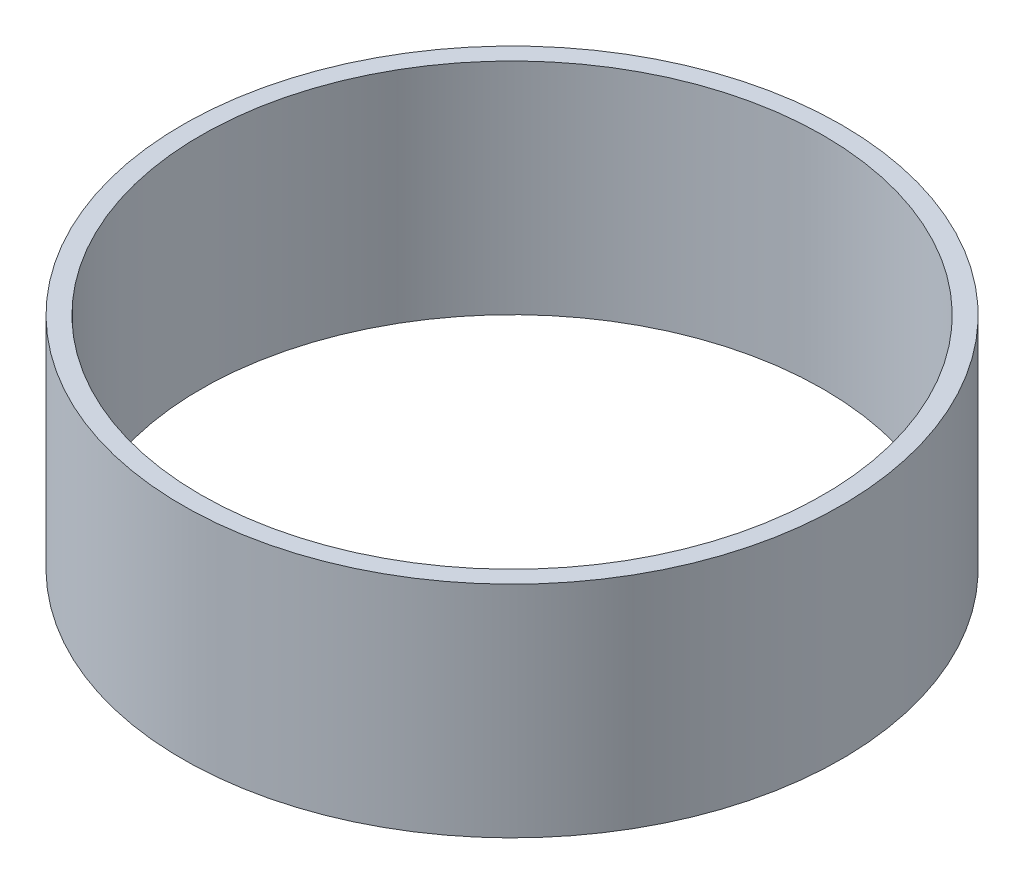
ISO-10303-21;
HEADER;
FILE_DESCRIPTION(('STEP AP214'),'2;1');
FILE_NAME('part.step','',(''),(''),'','','');
FILE_SCHEMA(('AUTOMOTIVE_DESIGN { 1 0 10303 214 1 1 1 1 }'));
ENDSEC;
DATA;
#1=APPLICATION_CONTEXT('core data for automotive mechanical design processes');
#2=APPLICATION_PROTOCOL_DEFINITION('international standard','automotive_design',2000,#1);
#3=PRODUCT_CONTEXT('',#1,'mechanical');
#4=PRODUCT('Part','Part','',(#3));
#5=PRODUCT_RELATED_PRODUCT_CATEGORY('part','',(#4));
#6=PRODUCT_DEFINITION_FORMATION('','',#4);
#7=PRODUCT_DEFINITION_CONTEXT('part definition',#1,'design');
#8=PRODUCT_DEFINITION('design','',#6,#7);
#9=PRODUCT_DEFINITION_SHAPE('','',#8);
#10=(LENGTH_UNIT() NAMED_UNIT(*) SI_UNIT(.MILLI.,.METRE.));
#11=(NAMED_UNIT(*) PLANE_ANGLE_UNIT() SI_UNIT($,.RADIAN.));
#12=(NAMED_UNIT(*) SI_UNIT($,.STERADIAN.) SOLID_ANGLE_UNIT());
#13=UNCERTAINTY_MEASURE_WITH_UNIT(LENGTH_MEASURE(1.E-05),#10,'distance_accuracy_value','');
#14=(GEOMETRIC_REPRESENTATION_CONTEXT(3) GLOBAL_UNCERTAINTY_ASSIGNED_CONTEXT((#13)) GLOBAL_UNIT_ASSIGNED_CONTEXT((#10,
#11,#12)) REPRESENTATION_CONTEXT('',''));
#15=CARTESIAN_POINT('',(0.,0.,0.));
#16=DIRECTION('',(0.,0.,1.));
#17=DIRECTION('',(1.,0.,0.));
#18=AXIS2_PLACEMENT_3D('',#15,#16,#17);
#19=CARTESIAN_POINT('',(0.,1219.2,0.));
#20=DIRECTION('',(0.,1.,0.));
#21=DIRECTION('',(0.,0.,1.));
#22=AXIS2_PLACEMENT_3D('',#19,#20,#21);
#23=PLANE('',#22);
#24=CARTESIAN_POINT('',(0.,1219.2,0.));
#25=DIRECTION('',(0.,1.,0.));
#26=DIRECTION('',(0.,0.,1.));
#27=AXIS2_PLACEMENT_3D('',#24,#25,#26);
#28=CIRCLE('',#27,1828.8);
#29=CARTESIAN_POINT('',(0.,1219.2,-1828.8));
#30=VERTEX_POINT('',#29);
#31=EDGE_CURVE('E10',#30,#30,#28,.T.);
#32=ORIENTED_EDGE('',*,*,#31,.T.);
#33=EDGE_LOOP('',(#32));
#34=FACE_BOUND('',#33,.T.);
#35=CARTESIAN_POINT('',(0.,1219.2,0.));
#36=DIRECTION('',(0.,1.,0.));
#37=DIRECTION('',(0.,0.,1.));
#38=AXIS2_PLACEMENT_3D('',#35,#36,#37);
#39=CIRCLE('',#38,1727.2);
#40=CARTESIAN_POINT('',(0.,1219.2,-1727.2));
#41=VERTEX_POINT('',#40);
#42=EDGE_CURVE('E50',#41,#41,#39,.T.);
#43=ORIENTED_EDGE('',*,*,#42,.F.);
#44=EDGE_LOOP('',(#43));
#45=FACE_BOUND('',#44,.T.);
#46=ADVANCED_FACE('F37',(#34,#45),#23,.T.);
#47=CARTESIAN_POINT('',(0.,0.,0.));
#48=DIRECTION('',(0.,1.,0.));
#49=DIRECTION('',(0.,0.,1.));
#50=AXIS2_PLACEMENT_3D('',#47,#48,#49);
#51=PLANE('',#50);
#52=CARTESIAN_POINT('',(0.,0.,0.));
#53=DIRECTION('',(0.,1.,0.));
#54=DIRECTION('',(0.,0.,1.));
#55=AXIS2_PLACEMENT_3D('',#52,#53,#54);
#56=CIRCLE('',#55,1828.8);
#57=CARTESIAN_POINT('',(0.,0.,-1828.8));
#58=VERTEX_POINT('',#57);
#59=EDGE_CURVE('E41',#58,#58,#56,.T.);
#60=ORIENTED_EDGE('',*,*,#59,.F.);
#61=EDGE_LOOP('',(#60));
#62=FACE_BOUND('',#61,.T.);
#63=CARTESIAN_POINT('',(0.,0.,0.));
#64=DIRECTION('',(0.,1.,0.));
#65=DIRECTION('',(0.,0.,1.));
#66=AXIS2_PLACEMENT_3D('',#63,#64,#65);
#67=CIRCLE('',#66,1727.2);
#68=CARTESIAN_POINT('',(0.,0.,-1727.2));
#69=VERTEX_POINT('',#68);
#70=EDGE_CURVE('E52',#69,#69,#67,.T.);
#71=ORIENTED_EDGE('',*,*,#70,.T.);
#72=EDGE_LOOP('',(#71));
#73=FACE_BOUND('',#72,.T.);
#74=ADVANCED_FACE('F64',(#62,#73),#51,.F.);
#75=CARTESIAN_POINT('',(0.,1219.2,0.));
#76=DIRECTION('',(0.,-1.,0.));
#77=DIRECTION('',(0.,0.,-1.));
#78=AXIS2_PLACEMENT_3D('',#75,#76,#77);
#79=CYLINDRICAL_SURFACE('',#78,1828.8);
#80=CARTESIAN_POINT('',(0.,1219.2,-1828.8));
#81=CARTESIAN_POINT('',(0.,1206.5,-1828.8));
#82=CARTESIAN_POINT('',(0.,1193.8,-1828.8));
#83=CARTESIAN_POINT('',(0.,1168.4,-1828.8));
#84=CARTESIAN_POINT('',(0.,1155.7,-1828.8));
#85=CARTESIAN_POINT('',(0.,1130.3,-1828.8));
#86=CARTESIAN_POINT('',(0.,1117.6,-1828.8));
#87=CARTESIAN_POINT('',(0.,1092.2,-1828.8));
#88=CARTESIAN_POINT('',(0.,1079.5,-1828.8));
#89=CARTESIAN_POINT('',(0.,1054.1,-1828.8));
#90=CARTESIAN_POINT('',(0.,1041.4,-1828.8));
#91=CARTESIAN_POINT('',(0.,1016.,-1828.8));
#92=CARTESIAN_POINT('',(0.,1003.3,-1828.8));
#93=CARTESIAN_POINT('',(0.,977.9,-1828.8));
#94=CARTESIAN_POINT('',(0.,965.2,-1828.8));
#95=CARTESIAN_POINT('',(0.,939.8,-1828.8));
#96=CARTESIAN_POINT('',(0.,927.1,-1828.8));
#97=CARTESIAN_POINT('',(0.,901.7,-1828.8));
#98=CARTESIAN_POINT('',(0.,889.,-1828.8));
#99=CARTESIAN_POINT('',(0.,863.6,-1828.8));
#100=CARTESIAN_POINT('',(0.,850.9,-1828.8));
#101=CARTESIAN_POINT('',(0.,825.5,-1828.8));
#102=CARTESIAN_POINT('',(0.,812.8,-1828.8));
#103=CARTESIAN_POINT('',(0.,787.4,-1828.8));
#104=CARTESIAN_POINT('',(0.,774.7,-1828.8));
#105=CARTESIAN_POINT('',(0.,749.3,-1828.8));
#106=CARTESIAN_POINT('',(0.,736.6,-1828.8));
#107=CARTESIAN_POINT('',(0.,711.2,-1828.8));
#108=CARTESIAN_POINT('',(0.,698.5,-1828.8));
#109=CARTESIAN_POINT('',(0.,673.1,-1828.8));
#110=CARTESIAN_POINT('',(0.,660.4,-1828.8));
#111=CARTESIAN_POINT('',(0.,635.,-1828.8));
#112=CARTESIAN_POINT('',(0.,622.3,-1828.8));
#113=CARTESIAN_POINT('',(0.,596.9,-1828.8));
#114=CARTESIAN_POINT('',(0.,584.2,-1828.8));
#115=CARTESIAN_POINT('',(0.,558.8,-1828.8));
#116=CARTESIAN_POINT('',(0.,546.1,-1828.8));
#117=CARTESIAN_POINT('',(0.,520.7,-1828.8));
#118=CARTESIAN_POINT('',(0.,508.,-1828.8));
#119=CARTESIAN_POINT('',(0.,482.6,-1828.8));
#120=CARTESIAN_POINT('',(0.,469.9,-1828.8));
#121=CARTESIAN_POINT('',(0.,444.5,-1828.8));
#122=CARTESIAN_POINT('',(0.,431.8,-1828.8));
#123=CARTESIAN_POINT('',(0.,406.4,-1828.8));
#124=CARTESIAN_POINT('',(0.,393.7,-1828.8));
#125=CARTESIAN_POINT('',(0.,368.3,-1828.8));
#126=CARTESIAN_POINT('',(0.,355.6,-1828.8));
#127=CARTESIAN_POINT('',(0.,330.2,-1828.8));
#128=CARTESIAN_POINT('',(0.,317.5,-1828.8));
#129=CARTESIAN_POINT('',(0.,292.1,-1828.8));
#130=CARTESIAN_POINT('',(0.,279.4,-1828.8));
#131=CARTESIAN_POINT('',(0.,254.,-1828.8));
#132=CARTESIAN_POINT('',(0.,241.3,-1828.8));
#133=CARTESIAN_POINT('',(0.,215.9,-1828.8));
#134=CARTESIAN_POINT('',(0.,203.2,-1828.8));
#135=CARTESIAN_POINT('',(0.,177.8,-1828.8));
#136=CARTESIAN_POINT('',(0.,165.1,-1828.8));
#137=CARTESIAN_POINT('',(0.,139.7,-1828.8));
#138=CARTESIAN_POINT('',(0.,127.,-1828.8));
#139=CARTESIAN_POINT('',(0.,101.6,-1828.8));
#140=CARTESIAN_POINT('',(0.,88.9,-1828.8));
#141=CARTESIAN_POINT('',(0.,63.5,-1828.8));
#142=CARTESIAN_POINT('',(0.,50.8,-1828.8));
#143=CARTESIAN_POINT('',(0.,25.4,-1828.8));
#144=CARTESIAN_POINT('',(0.,12.7,-1828.8));
#145=CARTESIAN_POINT('',(0.,0.,-1828.8));
#146=B_SPLINE_CURVE_WITH_KNOTS('',3,(#80,#81,#82,#83,#84,#85,#86,#87,#88,#89,#90,#91,#92,#93,
#94,#95,#96,#97,#98,#99,#100,#101,#102,#103,#104,#105,#106,#107,#108,#109,#110,#111,#112,#113,
#114,#115,#116,#117,#118,#119,#120,#121,#122,#123,#124,#125,#126,#127,#128,#129,#130,#131,#132,
#133,#134,#135,#136,#137,#138,#139,#140,#141,#142,#143,#144,#145),.UNSPECIFIED.,.F.,.F.,(4,2,2,
2,2,2,2,2,2,2,2,2,2,2,2,2,2,2,2,2,2,2,2,2,2,2,2,2,2,2,2,2,4),(0.,38.1,76.2,114.3,152.4,190.5,
228.6,266.7,304.8,342.9,381.,419.1,457.2,495.3,533.4,571.5,609.6,647.7,685.8,723.9,762.,800.1,
838.2,876.3,914.4,952.5,990.6,1028.7,1066.8,1104.9,1143.,1181.1,1219.2),.UNSPECIFIED.);
#147=EDGE_CURVE('BSEAM39',#30,#58,#146,.T.);
#148=ORIENTED_EDGE('',*,*,#31,.F.);
#149=ORIENTED_EDGE('',*,*,#59,.T.);
#150=ORIENTED_EDGE('',*,*,#147,.T.);
#151=ORIENTED_EDGE('',*,*,#147,.F.);
#152=EDGE_LOOP('',(#148,#150,#149,#151));
#153=FACE_BOUND('',#152,.T.);
#154=ADVANCED_FACE('F39',(#153),#79,.T.);
#155=CARTESIAN_POINT('',(0.,1219.2,0.));
#156=DIRECTION('',(0.,-1.,0.));
#157=DIRECTION('',(0.,0.,-1.));
#158=AXIS2_PLACEMENT_3D('',#155,#156,#157);
#159=CYLINDRICAL_SURFACE('',#158,1727.2);
#160=CARTESIAN_POINT('',(0.,1219.2,-1727.2));
#161=CARTESIAN_POINT('',(0.,1206.5,-1727.2));
#162=CARTESIAN_POINT('',(0.,1193.8,-1727.2));
#163=CARTESIAN_POINT('',(0.,1168.4,-1727.2));
#164=CARTESIAN_POINT('',(0.,1155.7,-1727.2));
#165=CARTESIAN_POINT('',(0.,1130.3,-1727.2));
#166=CARTESIAN_POINT('',(0.,1117.6,-1727.2));
#167=CARTESIAN_POINT('',(0.,1092.2,-1727.2));
#168=CARTESIAN_POINT('',(0.,1079.5,-1727.2));
#169=CARTESIAN_POINT('',(0.,1054.1,-1727.2));
#170=CARTESIAN_POINT('',(0.,1041.4,-1727.2));
#171=CARTESIAN_POINT('',(0.,1016.,-1727.2));
#172=CARTESIAN_POINT('',(0.,1003.3,-1727.2));
#173=CARTESIAN_POINT('',(0.,977.9,-1727.2));
#174=CARTESIAN_POINT('',(0.,965.2,-1727.2));
#175=CARTESIAN_POINT('',(0.,939.8,-1727.2));
#176=CARTESIAN_POINT('',(0.,927.1,-1727.2));
#177=CARTESIAN_POINT('',(0.,901.7,-1727.2));
#178=CARTESIAN_POINT('',(0.,889.,-1727.2));
#179=CARTESIAN_POINT('',(0.,863.6,-1727.2));
#180=CARTESIAN_POINT('',(0.,850.9,-1727.2));
#181=CARTESIAN_POINT('',(0.,825.5,-1727.2));
#182=CARTESIAN_POINT('',(0.,812.8,-1727.2));
#183=CARTESIAN_POINT('',(0.,787.4,-1727.2));
#184=CARTESIAN_POINT('',(0.,774.7,-1727.2));
#185=CARTESIAN_POINT('',(0.,749.3,-1727.2));
#186=CARTESIAN_POINT('',(0.,736.6,-1727.2));
#187=CARTESIAN_POINT('',(0.,711.2,-1727.2));
#188=CARTESIAN_POINT('',(0.,698.5,-1727.2));
#189=CARTESIAN_POINT('',(0.,673.1,-1727.2));
#190=CARTESIAN_POINT('',(0.,660.4,-1727.2));
#191=CARTESIAN_POINT('',(0.,635.,-1727.2));
#192=CARTESIAN_POINT('',(0.,622.3,-1727.2));
#193=CARTESIAN_POINT('',(0.,596.9,-1727.2));
#194=CARTESIAN_POINT('',(0.,584.2,-1727.2));
#195=CARTESIAN_POINT('',(0.,558.8,-1727.2));
#196=CARTESIAN_POINT('',(0.,546.1,-1727.2));
#197=CARTESIAN_POINT('',(0.,520.7,-1727.2));
#198=CARTESIAN_POINT('',(0.,508.,-1727.2));
#199=CARTESIAN_POINT('',(0.,482.6,-1727.2));
#200=CARTESIAN_POINT('',(0.,469.9,-1727.2));
#201=CARTESIAN_POINT('',(0.,444.5,-1727.2));
#202=CARTESIAN_POINT('',(0.,431.8,-1727.2));
#203=CARTESIAN_POINT('',(0.,406.4,-1727.2));
#204=CARTESIAN_POINT('',(0.,393.7,-1727.2));
#205=CARTESIAN_POINT('',(0.,368.3,-1727.2));
#206=CARTESIAN_POINT('',(0.,355.6,-1727.2));
#207=CARTESIAN_POINT('',(0.,330.2,-1727.2));
#208=CARTESIAN_POINT('',(0.,317.5,-1727.2));
#209=CARTESIAN_POINT('',(0.,292.1,-1727.2));
#210=CARTESIAN_POINT('',(0.,279.4,-1727.2));
#211=CARTESIAN_POINT('',(0.,254.,-1727.2));
#212=CARTESIAN_POINT('',(0.,241.3,-1727.2));
#213=CARTESIAN_POINT('',(0.,215.9,-1727.2));
#214=CARTESIAN_POINT('',(0.,203.2,-1727.2));
#215=CARTESIAN_POINT('',(0.,177.8,-1727.2));
#216=CARTESIAN_POINT('',(0.,165.1,-1727.2));
#217=CARTESIAN_POINT('',(0.,139.7,-1727.2));
#218=CARTESIAN_POINT('',(0.,127.,-1727.2));
#219=CARTESIAN_POINT('',(0.,101.6,-1727.2));
#220=CARTESIAN_POINT('',(0.,88.9,-1727.2));
#221=CARTESIAN_POINT('',(0.,63.5,-1727.2));
#222=CARTESIAN_POINT('',(0.,50.8,-1727.2));
#223=CARTESIAN_POINT('',(0.,25.4,-1727.2));
#224=CARTESIAN_POINT('',(0.,12.7,-1727.2));
#225=CARTESIAN_POINT('',(0.,0.,-1727.2));
#226=B_SPLINE_CURVE_WITH_KNOTS('',3,(#160,#161,#162,#163,#164,#165,#166,#167,#168,#169,#170,
#171,#172,#173,#174,#175,#176,#177,#178,#179,#180,#181,#182,#183,#184,#185,#186,#187,#188,#189,
#190,#191,#192,#193,#194,#195,#196,#197,#198,#199,#200,#201,#202,#203,#204,#205,#206,#207,#208,
#209,#210,#211,#212,#213,#214,#215,#216,#217,#218,#219,#220,#221,#222,#223,#224,#225),
.UNSPECIFIED.,.F.,.F.,(4,2,2,2,2,2,2,2,2,2,2,2,2,2,2,2,2,2,2,2,2,2,2,2,2,2,2,2,2,2,2,2,4),(0.,
38.1,76.2,114.3,152.4,190.5,228.6,266.7,304.8,342.9,381.,419.1,457.2,495.3,533.4,571.5,609.6,
647.7,685.8,723.9,762.,800.1,838.2,876.3,914.4,952.5,990.6,1028.7,1066.8,1104.9,1143.,1181.1,
1219.2),.UNSPECIFIED.);
#227=EDGE_CURVE('BSEAM60',#41,#69,#226,.T.);
#228=ORIENTED_EDGE('',*,*,#42,.T.);
#229=ORIENTED_EDGE('',*,*,#70,.F.);
#230=ORIENTED_EDGE('',*,*,#227,.T.);
#231=ORIENTED_EDGE('',*,*,#227,.F.);
#232=EDGE_LOOP('',(#228,#230,#229,#231));
#233=FACE_BOUND('',#232,.T.);
#234=ADVANCED_FACE('F60',(#233),#159,.F.);
#235=CLOSED_SHELL('',(#46,#74,#154,#234));
#236=MANIFOLD_SOLID_BREP('B2',#235);
#237=ADVANCED_BREP_SHAPE_REPRESENTATION('',(#18,#236),#14);
#238=SHAPE_DEFINITION_REPRESENTATION(#9,#237);
ENDSEC;
END-ISO-10303-21;
